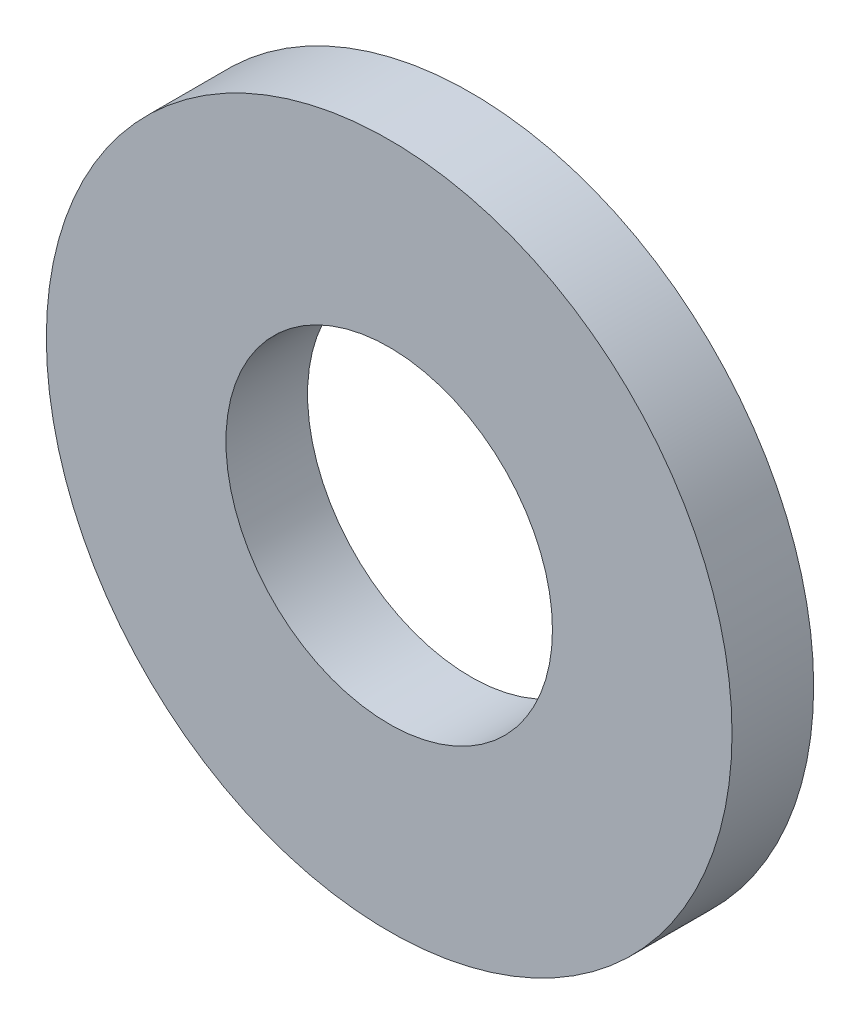
ISO-10303-21;
HEADER;
FILE_DESCRIPTION(('STEP AP214'),'2;1');
FILE_NAME('part.step','',(''),(''),'','','');
FILE_SCHEMA(('AUTOMOTIVE_DESIGN { 1 0 10303 214 1 1 1 1 }'));
ENDSEC;
DATA;
#1=APPLICATION_CONTEXT('core data for automotive mechanical design processes');
#2=APPLICATION_PROTOCOL_DEFINITION('international standard','automotive_design',2000,#1);
#3=PRODUCT_CONTEXT('',#1,'mechanical');
#4=PRODUCT('Part','Part','',(#3));
#5=PRODUCT_RELATED_PRODUCT_CATEGORY('part','',(#4));
#6=PRODUCT_DEFINITION_FORMATION('','',#4);
#7=PRODUCT_DEFINITION_CONTEXT('part definition',#1,'design');
#8=PRODUCT_DEFINITION('design','',#6,#7);
#9=PRODUCT_DEFINITION_SHAPE('','',#8);
#10=(LENGTH_UNIT() NAMED_UNIT(*) SI_UNIT(.MILLI.,.METRE.));
#11=(NAMED_UNIT(*) PLANE_ANGLE_UNIT() SI_UNIT($,.RADIAN.));
#12=(NAMED_UNIT(*) SI_UNIT($,.STERADIAN.) SOLID_ANGLE_UNIT());
#13=UNCERTAINTY_MEASURE_WITH_UNIT(LENGTH_MEASURE(1.E-05),#10,'distance_accuracy_value','');
#14=(GEOMETRIC_REPRESENTATION_CONTEXT(3) GLOBAL_UNCERTAINTY_ASSIGNED_CONTEXT((#13)) GLOBAL_UNIT_ASSIGNED_CONTEXT((#10,
#11,#12)) REPRESENTATION_CONTEXT('',''));
#15=CARTESIAN_POINT('',(0.,0.,0.));
#16=DIRECTION('',(0.,0.,1.));
#17=DIRECTION('',(1.,0.,0.));
#18=AXIS2_PLACEMENT_3D('',#15,#16,#17);
#19=CARTESIAN_POINT('',(0.,0.,2.5));
#20=DIRECTION('',(0.,0.,1.));
#21=DIRECTION('',(1.,0.,0.));
#22=AXIS2_PLACEMENT_3D('',#19,#20,#21);
#23=PLANE('',#22);
#24=CARTESIAN_POINT('',(0.,0.,2.5));
#25=DIRECTION('',(0.,0.,1.));
#26=DIRECTION('',(1.,0.,0.));
#27=AXIS2_PLACEMENT_3D('',#24,#25,#26);
#28=CIRCLE('',#27,10.5);
#29=CARTESIAN_POINT('',(10.5,0.,2.5));
#30=VERTEX_POINT('',#29);
#31=EDGE_CURVE('E10',#30,#30,#28,.T.);
#32=ORIENTED_EDGE('',*,*,#31,.T.);
#33=EDGE_LOOP('',(#32));
#34=FACE_BOUND('',#33,.T.);
#35=CARTESIAN_POINT('',(0.,0.,2.5));
#36=DIRECTION('',(0.,0.,1.));
#37=DIRECTION('',(1.,0.,0.));
#38=AXIS2_PLACEMENT_3D('',#35,#36,#37);
#39=CIRCLE('',#38,5.);
#40=CARTESIAN_POINT('',(5.,0.,2.5));
#41=VERTEX_POINT('',#40);
#42=EDGE_CURVE('E50',#41,#41,#39,.T.);
#43=ORIENTED_EDGE('',*,*,#42,.F.);
#44=EDGE_LOOP('',(#43));
#45=FACE_BOUND('',#44,.T.);
#46=ADVANCED_FACE('F39',(#34,#45),#23,.T.);
#47=CARTESIAN_POINT('',(0.,0.,0.));
#48=DIRECTION('',(0.,0.,1.));
#49=DIRECTION('',(1.,0.,0.));
#50=AXIS2_PLACEMENT_3D('',#47,#48,#49);
#51=PLANE('',#50);
#52=CARTESIAN_POINT('',(0.,0.,0.));
#53=DIRECTION('',(0.,0.,1.));
#54=DIRECTION('',(1.,0.,0.));
#55=AXIS2_PLACEMENT_3D('',#52,#53,#54);
#56=CIRCLE('',#55,10.5);
#57=CARTESIAN_POINT('',(10.5,0.,0.));
#58=VERTEX_POINT('',#57);
#59=EDGE_CURVE('E43',#58,#58,#56,.T.);
#60=ORIENTED_EDGE('',*,*,#59,.F.);
#61=EDGE_LOOP('',(#60));
#62=FACE_BOUND('',#61,.T.);
#63=CARTESIAN_POINT('',(0.,0.,0.));
#64=DIRECTION('',(0.,0.,1.));
#65=DIRECTION('',(1.,0.,0.));
#66=AXIS2_PLACEMENT_3D('',#63,#64,#65);
#67=CIRCLE('',#66,5.);
#68=CARTESIAN_POINT('',(5.,0.,0.));
#69=VERTEX_POINT('',#68);
#70=EDGE_CURVE('E52',#69,#69,#67,.T.);
#71=ORIENTED_EDGE('',*,*,#70,.T.);
#72=EDGE_LOOP('',(#71));
#73=FACE_BOUND('',#72,.T.);
#74=ADVANCED_FACE('F62',(#62,#73),#51,.F.);
#75=CARTESIAN_POINT('',(0.,0.,2.5));
#76=DIRECTION('',(0.,0.,-1.));
#77=DIRECTION('',(-1.,0.,0.));
#78=AXIS2_PLACEMENT_3D('',#75,#76,#77);
#79=CYLINDRICAL_SURFACE('',#78,10.5);
#80=ORIENTED_EDGE('',*,*,#31,.F.);
#81=EDGE_LOOP('',(#80));
#82=FACE_BOUND('',#81,.T.);
#83=ORIENTED_EDGE('',*,*,#59,.T.);
#84=EDGE_LOOP('',(#83));
#85=FACE_BOUND('',#84,.T.);
#86=ADVANCED_FACE('F41',(#82,#85),#79,.T.);
#87=CARTESIAN_POINT('',(0.,0.,2.5));
#88=DIRECTION('',(0.,0.,-1.));
#89=DIRECTION('',(-1.,0.,0.));
#90=AXIS2_PLACEMENT_3D('',#87,#88,#89);
#91=CYLINDRICAL_SURFACE('',#90,5.);
#92=ORIENTED_EDGE('',*,*,#42,.T.);
#93=EDGE_LOOP('',(#92));
#94=FACE_BOUND('',#93,.T.);
#95=ORIENTED_EDGE('',*,*,#70,.F.);
#96=EDGE_LOOP('',(#95));
#97=FACE_BOUND('',#96,.T.);
#98=ADVANCED_FACE('F58',(#94,#97),#91,.F.);
#99=CLOSED_SHELL('',(#46,#74,#86,#98));
#100=MANIFOLD_SOLID_BREP('B2',#99);
#101=ADVANCED_BREP_SHAPE_REPRESENTATION('',(#18,#100),#14);
#102=SHAPE_DEFINITION_REPRESENTATION(#9,#101);
ENDSEC;
END-ISO-10303-21;
